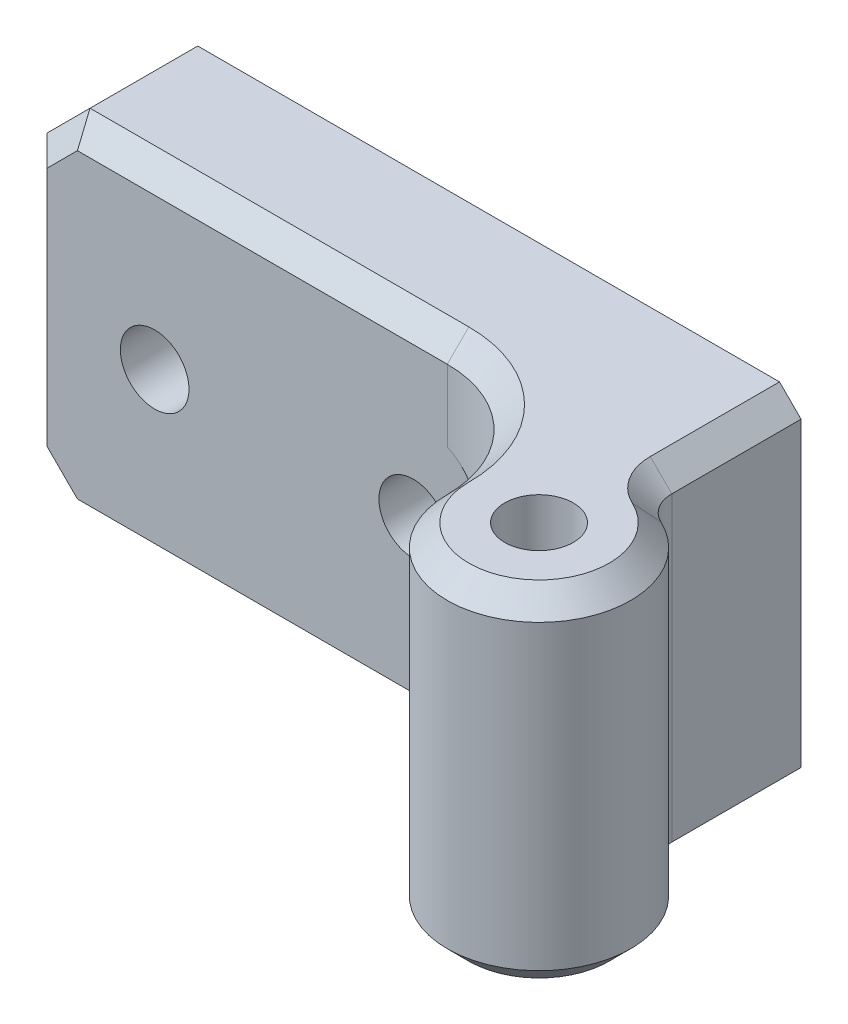
ISO-10303-21;
HEADER;
FILE_DESCRIPTION(('STEP AP214'),'2;1');
FILE_NAME('part.step','',(''),(''),'','','');
FILE_SCHEMA(('AUTOMOTIVE_DESIGN { 1 0 10303 214 1 1 1 1 }'));
ENDSEC;
DATA;
#1=APPLICATION_CONTEXT('core data for automotive mechanical design processes');
#2=APPLICATION_PROTOCOL_DEFINITION('international standard','automotive_design',2000,#1);
#3=PRODUCT_CONTEXT('',#1,'mechanical');
#4=PRODUCT('Part','Part','',(#3));
#5=PRODUCT_RELATED_PRODUCT_CATEGORY('part','',(#4));
#6=PRODUCT_DEFINITION_FORMATION('','',#4);
#7=PRODUCT_DEFINITION_CONTEXT('part definition',#1,'design');
#8=PRODUCT_DEFINITION('design','',#6,#7);
#9=PRODUCT_DEFINITION_SHAPE('','',#8);
#10=(LENGTH_UNIT() NAMED_UNIT(*) SI_UNIT(.MILLI.,.METRE.));
#11=(NAMED_UNIT(*) PLANE_ANGLE_UNIT() SI_UNIT($,.RADIAN.));
#12=(NAMED_UNIT(*) SI_UNIT($,.STERADIAN.) SOLID_ANGLE_UNIT());
#13=UNCERTAINTY_MEASURE_WITH_UNIT(LENGTH_MEASURE(1.E-05),#10,'distance_accuracy_value','');
#14=(GEOMETRIC_REPRESENTATION_CONTEXT(3) GLOBAL_UNCERTAINTY_ASSIGNED_CONTEXT((#13)) GLOBAL_UNIT_ASSIGNED_CONTEXT((#10,
#11,#12)) REPRESENTATION_CONTEXT('',''));
#15=CARTESIAN_POINT('',(0.,0.,0.));
#16=DIRECTION('',(0.,0.,1.));
#17=DIRECTION('',(1.,0.,0.));
#18=AXIS2_PLACEMENT_3D('',#15,#16,#17);
#19=CARTESIAN_POINT('',(-7.01475572015018,730.7032731794,17.8437680924646));
#20=DIRECTION('',(0.,-1.,0.));
#21=DIRECTION('',(1.,0.,0.));
#22=AXIS2_PLACEMENT_3D('',#19,#20,#21);
#23=CYLINDRICAL_SURFACE('',#22,8.31876809246463);
#24=DIRECTION('',(0.,-1.,0.));
#25=VECTOR('',#24,1.);
#26=CARTESIAN_POINT('',(-7.01475572015018,730.7032731794,9.525));
#27=LINE('',#26,#25);
#28=CARTESIAN_POINT('',(-7.01475572015023,709.342729864242,9.525));
#29=VERTEX_POINT('',#28);
#30=CARTESIAN_POINT('',(-7.01475572015024,704.062997102467,9.525));
#31=VERTEX_POINT('',#30);
#32=EDGE_CURVE('E171',#29,#31,#27,.T.);
#33=ORIENTED_EDGE('',*,*,#32,.T.);
#34=CARTESIAN_POINT('',(-7.01475572015028,692.397462626016,9.525));
#35=CARTESIAN_POINT('',(-6.8585295064759,692.464663720382,9.52497377656188));
#36=CARTESIAN_POINT('',(-6.70508771352782,692.538170334425,9.52939946140922));
#37=CARTESIAN_POINT('',(-6.40504056937207,692.696964266671,9.54602231330409));
#38=CARTESIAN_POINT('',(-6.25842888259299,692.782240364319,9.55821211789542));
#39=CARTESIAN_POINT('',(-5.97379153276575,692.963375361611,9.58915008136983));
#40=CARTESIAN_POINT('',(-5.83572321944625,693.05917370387,9.60786193280645));
#41=CARTESIAN_POINT('',(-5.5681022614574,693.260969697122,9.65063339302287));
#42=CARTESIAN_POINT('',(-5.43855152139169,693.366969616309,9.67469419263988));
#43=CARTESIAN_POINT('',(-5.18911936527021,693.587998403627,9.72680222442425));
#44=CARTESIAN_POINT('',(-5.06920504108459,693.702993642958,9.7548348994686));
#45=CARTESIAN_POINT('',(-4.83903065065736,693.941676538618,9.81368467425718));
#46=CARTESIAN_POINT('',(-4.72877392650021,694.065367177574,9.84450273046571));
#47=CARTESIAN_POINT('',(-4.51824865142741,694.320958928606,9.90768248152465));
#48=CARTESIAN_POINT('',(-4.41799705985544,694.452873385828,9.94004666435188));
#49=CARTESIAN_POINT('',(-4.22811737946885,694.724100553597,10.0049786968128));
#50=CARTESIAN_POINT('',(-4.13849004608864,694.863413789213,10.0375465607561));
#51=CARTESIAN_POINT('',(-3.96311783128938,695.160982795241,10.1043269198427));
#52=CARTESIAN_POINT('',(-3.87835534941497,695.319840936982,10.1384429209656));
#53=CARTESIAN_POINT('',(-3.72245447219442,695.644616220251,10.2037550205844));
#54=CARTESIAN_POINT('',(-3.65131102610542,695.810530716859,10.2349521993491));
#55=CARTESIAN_POINT('',(-3.52324371163861,696.148395956546,10.292861727735));
#56=CARTESIAN_POINT('',(-3.46630983961277,696.320342355298,10.319577228123));
#57=CARTESIAN_POINT('',(-3.36718704223734,696.669231093844,10.3671261538804));
#58=CARTESIAN_POINT('',(-3.32499688676546,696.84617301551,10.387960069944));
#59=CARTESIAN_POINT('',(-3.25711624304527,697.197296930048,10.4219462491075));
#60=CARTESIAN_POINT('',(-3.23088898815425,697.371350841382,10.435346883215));
#61=CARTESIAN_POINT('',(-3.19296749988555,697.721446642952,10.4548374082125));
#62=CARTESIAN_POINT('',(-3.18127286856042,697.897488478619,10.4609274992874));
#63=CARTESIAN_POINT('',(-3.17258475369475,698.249971687342,10.4654451552841));
#64=CARTESIAN_POINT('',(-3.17558610152534,698.426412898117,10.4638754141972));
#65=CARTESIAN_POINT('',(-3.19623405680679,698.778194598415,10.4531707804918));
#66=CARTESIAN_POINT('',(-3.21387996196047,698.953535140317,10.4440362506518));
#67=CARTESIAN_POINT('',(-3.26122724520423,699.285223026345,10.4199175273034));
#68=CARTESIAN_POINT('',(-3.28963570089525,699.441802969189,10.4055657798248));
#69=CARTESIAN_POINT('',(-3.35796741384964,699.751887725597,10.371737684766));
#70=CARTESIAN_POINT('',(-3.39789453506229,699.905391488744,10.3522596177487));
#71=CARTESIAN_POINT('',(-3.53442152130737,700.359884684429,10.2873503798431));
#72=CARTESIAN_POINT('',(-3.64779588980144,700.655054953801,10.2354279676237));
#73=CARTESIAN_POINT('',(-3.92499597303092,701.24269614694,10.1185354161637));
#74=CARTESIAN_POINT('',(-4.09166438912317,701.533695186883,10.0529291202356));
#75=CARTESIAN_POINT('',(-4.37426339257399,701.947814941693,9.95455499400188));
#76=CARTESIAN_POINT('',(-4.47400374658584,702.082239611861,9.92173900705312));
#77=CARTESIAN_POINT('',(-4.68399865787901,702.343041744447,9.85743428229677));
#78=CARTESIAN_POINT('',(-4.79425506957798,702.46941778098,9.82594577999683));
#79=CARTESIAN_POINT('',(-5.03479041683673,702.723980224951,9.76302515759287));
#80=CARTESIAN_POINT('',(-5.16597664088253,702.851370898731,9.7318353727175));
#81=CARTESIAN_POINT('',(-5.43940520797831,703.094784602715,9.67433272291206));
#82=CARTESIAN_POINT('',(-5.58164232638203,703.21081294686,9.64801757302676));
#83=CARTESIAN_POINT('',(-5.87591836695125,703.430259022882,9.60197987236416));
#84=CARTESIAN_POINT('',(-6.02792895822961,703.533710895902,9.58223920812016));
#85=CARTESIAN_POINT('',(-6.3408867643811,703.727294038137,9.55085044069935));
#86=CARTESIAN_POINT('',(-6.50182565247476,703.817437441157,9.53919492968428));
#87=CARTESIAN_POINT('',(-6.7236838244021,703.929286108787,9.52989608922528));
#88=CARTESIAN_POINT('',(-6.78133935621798,703.957265544602,9.52807228124201));
#89=CARTESIAN_POINT('',(-6.8974513441391,704.01145689665,9.52562474136075));
#90=CARTESIAN_POINT('',(-6.95590721630708,704.037670026707,9.5250001770441));
#91=CARTESIAN_POINT('',(-7.01475572015025,704.062997102467,9.525));
#92=B_SPLINE_CURVE_WITH_KNOTS('',3,(#34,#35,#36,#37,#38,#39,#40,#41,#42,#43,#44,#45,#46,#47,#48,
#49,#50,#51,#52,#53,#54,#55,#56,#57,#58,#59,#60,#61,#62,#63,#64,#65,#66,#67,#68,#69,#70,#71,#72,
#73,#74,#75,#76,#77,#78,#79,#80,#81,#82,#83,#84,#85,#86,#87,#88,#89,#90,#91),.UNSPECIFIED.,.F.,
.F.,(4,2,2,2,2,2,2,2,2,2,2,2,2,2,2,2,2,2,2,2,2,2,2,2,2,2,2,2,4),(0.,0.509907809169994,
1.01933280816261,1.52596603634282,2.03271216951694,2.53764691502082,3.04275571224508,
3.54870665595174,4.05469355358308,4.60381710864594,5.15273662005111,5.70126859091361,
6.24975478481087,6.7785990222245,7.30742877795505,7.83607255571554,8.36469098319881,
8.8434890348074,9.32244788688929,10.2797675903837,11.3004531769402,11.8117477239014,
12.3231326006101,12.8789241369897,13.4344544865808,13.9884413739765,14.5419200106331,
14.7342246253894,14.9263957094022),.UNSPECIFIED.);
#93=CARTESIAN_POINT('',(-7.01475572015027,692.397462626016,9.525));
#94=VERTEX_POINT('',#93);
#95=EDGE_CURVE('E161',#94,#31,#92,.T.);
#96=ORIENTED_EDGE('',*,*,#95,.F.);
#97=CARTESIAN_POINT('',(-7.01475572015028,687.117729864242,9.525));
#98=VERTEX_POINT('',#97);
#99=EDGE_CURVE('E169',#94,#98,#27,.T.);
#100=ORIENTED_EDGE('',*,*,#99,.T.);
#101=CARTESIAN_POINT('',(-7.01475572015028,687.117729864242,17.8437680924646));
#102=DIRECTION('',(0.,1.,0.));
#103=DIRECTION('',(-1.,0.,0.));
#104=AXIS2_PLACEMENT_3D('',#101,#102,#103);
#105=CIRCLE('',#104,8.31876809246463);
#106=CARTESIAN_POINT('',(1.30401237231436,687.117729864242,17.8437680924646));
#107=VERTEX_POINT('',#106);
#108=EDGE_CURVE('E256',#98,#107,#105,.F.);
#109=ORIENTED_EDGE('',*,*,#108,.T.);
#110=DIRECTION('',(0.,-1.,0.));
#111=VECTOR('',#110,1.);
#112=CARTESIAN_POINT('',(1.30401237231446,730.7032731794,17.8437680924646));
#113=LINE('',#112,#111);
#114=CARTESIAN_POINT('',(1.30401237231441,709.342729864242,17.8437680924646));
#115=VERTEX_POINT('',#114);
#116=EDGE_CURVE('E178',#115,#107,#113,.T.);
#117=ORIENTED_EDGE('',*,*,#116,.F.);
#118=CARTESIAN_POINT('',(-7.01475572015023,709.342729864242,17.8437680924646));
#119=DIRECTION('',(0.,-1.,0.));
#120=DIRECTION('',(1.,0.,0.));
#121=AXIS2_PLACEMENT_3D('',#118,#119,#120);
#122=CIRCLE('',#121,8.31876809246463);
#123=EDGE_CURVE('E254',#115,#29,#122,.F.);
#124=ORIENTED_EDGE('',*,*,#123,.T.);
#125=EDGE_LOOP('',(#33,#96,#100,#109,#117,#124));
#126=FACE_BOUND('',#125,.T.);
#127=ADVANCED_FACE('F37',(#126),#23,.F.);
#128=CARTESIAN_POINT('',(-38.100000000032,710.930229864242,9.525));
#129=DIRECTION('',(0.,-1.,0.));
#130=DIRECTION('',(0.,0.,-1.));
#131=AXIS2_PLACEMENT_3D('',#128,#129,#130);
#132=PLANE('',#131);
#133=CARTESIAN_POINT('',(11.9503001493874,710.930229864242,9.525));
#134=DIRECTION('',(0.,-1.,0.));
#135=DIRECTION('',(0.,0.,-1.));
#136=AXIS2_PLACEMENT_3D('',#133,#134,#135);
#137=CIRCLE('',#136,4.01280014941934);
#138=CARTESIAN_POINT('',(10.2509532079631,710.930229864242,13.1602145757647));
#139=VERTEX_POINT('',#138);
#140=CARTESIAN_POINT('',(7.93749999996805,710.930229864242,9.525));
#141=VERTEX_POINT('',#140);
#142=EDGE_CURVE('E242',#139,#141,#137,.T.);
#143=ORIENTED_EDGE('',*,*,#142,.T.);
#144=DIRECTION('',(0.,0.,-1.));
#145=VECTOR('',#144,1.);
#146=CARTESIAN_POINT('',(7.93749999996798,710.930229864242,9.525));
#147=LINE('',#146,#145);
#148=CARTESIAN_POINT('',(7.93749999996798,710.930229864242,0.));
#149=VERTEX_POINT('',#148);
#150=EDGE_CURVE('E244',#141,#149,#147,.T.);
#151=ORIENTED_EDGE('',*,*,#150,.T.);
#152=DIRECTION('',(-1.,0.,0.));
#153=VECTOR('',#152,1.);
#154=CARTESIAN_POINT('',(-38.100000000032,710.930229864242,0.));
#155=LINE('',#154,#153);
#156=CARTESIAN_POINT('',(-34.925000000032,710.930229864242,0.));
#157=VERTEX_POINT('',#156);
#158=EDGE_CURVE('E194',#149,#157,#155,.T.);
#159=ORIENTED_EDGE('',*,*,#158,.T.);
#160=DIRECTION('',(0.,0.,1.));
#161=VECTOR('',#160,1.);
#162=CARTESIAN_POINT('',(-34.925000000032,710.930229864242,9.525));
#163=LINE('',#162,#161);
#164=CARTESIAN_POINT('',(-34.925000000032,710.930229864242,7.93750000000007));
#165=VERTEX_POINT('',#164);
#166=EDGE_CURVE('E214',#157,#165,#163,.T.);
#167=ORIENTED_EDGE('',*,*,#166,.T.);
#168=DIRECTION('',(1.,0.,0.));
#169=VECTOR('',#168,1.);
#170=CARTESIAN_POINT('',(-7.01475572015022,710.930229864242,7.93750000000001));
#171=LINE('',#170,#169);
#172=CARTESIAN_POINT('',(-7.01475572015023,710.930229864242,7.93750000000001));
#173=VERTEX_POINT('',#172);
#174=EDGE_CURVE('E236',#165,#173,#171,.T.);
#175=ORIENTED_EDGE('',*,*,#174,.T.);
#176=CARTESIAN_POINT('',(-7.01475572015022,710.930229864242,17.8437680924646));
#177=DIRECTION('',(0.,-1.,0.));
#178=DIRECTION('',(0.,0.,-1.));
#179=AXIS2_PLACEMENT_3D('',#176,#177,#178);
#180=CIRCLE('',#179,9.90626809246465);
#181=CARTESIAN_POINT('',(2.89151237231442,710.930229864242,17.8437680924646));
#182=VERTEX_POINT('',#181);
#183=EDGE_CURVE('E238',#173,#182,#180,.T.);
#184=ORIENTED_EDGE('',*,*,#183,.T.);
#185=CARTESIAN_POINT('',(8.06154122753639,710.930229864242,17.8437680924646));
#186=DIRECTION('',(0.,-1.,0.));
#187=DIRECTION('',(0.,0.,-1.));
#188=AXIS2_PLACEMENT_3D('',#185,#186,#187);
#189=CIRCLE('',#188,5.17002885522202);
#190=EDGE_CURVE('E240',#182,#139,#189,.F.);
#191=ORIENTED_EDGE('',*,*,#190,.T.);
#192=EDGE_LOOP('',(#143,#151,#159,#167,#175,#184,#191));
#193=FACE_BOUND('',#192,.T.);
#194=CARTESIAN_POINT('',(8.06154122753638,710.930229864242,17.8437680924646));
#195=DIRECTION('',(0.,1.,0.));
#196=DIRECTION('',(0.,0.,1.));
#197=AXIS2_PLACEMENT_3D('',#194,#195,#196);
#198=CIRCLE('',#197,2.5273);
#199=CARTESIAN_POINT('',(8.06154122753638,710.930229864242,20.3710680924646));
#200=VERTEX_POINT('',#199);
#201=EDGE_CURVE('E305',#200,#200,#198,.T.);
#202=ORIENTED_EDGE('',*,*,#201,.F.);
#203=EDGE_LOOP('',(#202));
#204=FACE_BOUND('',#203,.T.);
#205=ADVANCED_FACE('F352',(#193,#204),#132,.F.);
#206=CARTESIAN_POINT('',(0.,0.,9.525));
#207=DIRECTION('',(0.,0.,1.));
#208=DIRECTION('',(1.,0.,0.));
#209=AXIS2_PLACEMENT_3D('',#206,#207,#208);
#210=PLANE('',#209);
#211=CARTESIAN_POINT('',(-9.52500000003202,698.230229864242,9.525));
#212=DIRECTION('',(0.,0.,1.));
#213=DIRECTION('',(1.,0.,0.));
#214=AXIS2_PLACEMENT_3D('',#211,#212,#213);
#215=CIRCLE('',#214,6.35);
#216=EDGE_CURVE('E158',#94,#31,#215,.T.);
#217=ORIENTED_EDGE('',*,*,#216,.T.);
#218=ORIENTED_EDGE('',*,*,#32,.F.);
#219=DIRECTION('',(-1.,0.,0.));
#220=VECTOR('',#219,1.);
#221=CARTESIAN_POINT('',(-34.925000000032,709.342729864242,9.525));
#222=LINE('',#221,#220);
#223=CARTESIAN_POINT('',(-34.267435969765,709.342729864242,9.525));
#224=VERTEX_POINT('',#223);
#225=EDGE_CURVE('E260',#29,#224,#222,.T.);
#226=ORIENTED_EDGE('',*,*,#225,.T.);
#227=DIRECTION('',(-0.707106781186544,-0.707106781186551,0.));
#228=VECTOR('',#227,1.);
#229=CARTESIAN_POINT('',(-371.805082917003,371.805082917,9.525));
#230=LINE('',#229,#228);
#231=CARTESIAN_POINT('',(-36.5125000000321,707.097665833974,9.525));
#232=VERTEX_POINT('',#231);
#233=EDGE_CURVE('E258',#224,#232,#230,.T.);
#234=ORIENTED_EDGE('',*,*,#233,.T.);
#235=DIRECTION('',(0.,-1.,0.));
#236=VECTOR('',#235,1.);
#237=CARTESIAN_POINT('',(-36.5125000000321,688.705229864242,9.525));
#238=LINE('',#237,#236);
#239=CARTESIAN_POINT('',(-36.5125000000321,689.362793894509,9.525));
#240=VERTEX_POINT('',#239);
#241=EDGE_CURVE('E262',#232,#240,#238,.T.);
#242=ORIENTED_EDGE('',*,*,#241,.T.);
#243=DIRECTION('',(0.707106781186541,-0.707106781186554,0.));
#244=VECTOR('',#243,1.);
#245=CARTESIAN_POINT('',(326.425146947238,326.425146947232,9.525));
#246=LINE('',#245,#244);
#247=CARTESIAN_POINT('',(-34.2674359697646,687.117729864242,9.525));
#248=VERTEX_POINT('',#247);
#249=EDGE_CURVE('E264',#240,#248,#246,.T.);
#250=ORIENTED_EDGE('',*,*,#249,.T.);
#251=DIRECTION('',(1.,0.,0.));
#252=VECTOR('',#251,1.);
#253=CARTESIAN_POINT('',(-7.01475572015028,687.117729864242,9.525));
#254=LINE('',#253,#252);
#255=EDGE_CURVE('E176',#248,#98,#254,.T.);
#256=ORIENTED_EDGE('',*,*,#255,.T.);
#257=ORIENTED_EDGE('',*,*,#99,.F.);
#258=EDGE_LOOP('',(#217,#218,#226,#234,#242,#250,#256,#257));
#259=FACE_BOUND('',#258,.T.);
#260=CARTESIAN_POINT('',(-28.575000000032,698.230229864242,9.525));
#261=DIRECTION('',(0.,0.,1.));
#262=DIRECTION('',(1.,0.,0.));
#263=AXIS2_PLACEMENT_3D('',#260,#261,#262);
#264=CIRCLE('',#263,2.52729999999999);
#265=CARTESIAN_POINT('',(-26.047700000032,698.230229864242,9.525));
#266=VERTEX_POINT('',#265);
#267=EDGE_CURVE('E317',#266,#266,#264,.T.);
#268=ORIENTED_EDGE('',*,*,#267,.F.);
#269=EDGE_LOOP('',(#268));
#270=FACE_BOUND('',#269,.T.);
#271=CARTESIAN_POINT('',(-9.52500000003202,698.230229864242,9.525));
#272=DIRECTION('',(0.,0.,-1.));
#273=DIRECTION('',(-1.,0.,0.));
#274=AXIS2_PLACEMENT_3D('',#271,#272,#273);
#275=CIRCLE('',#274,2.5273);
#276=CARTESIAN_POINT('',(-12.052300000032,698.230229864242,9.525));
#277=VERTEX_POINT('',#276);
#278=EDGE_CURVE('E11',#277,#277,#275,.F.);
#279=ORIENTED_EDGE('',*,*,#278,.F.);
#280=EDGE_LOOP('',(#279));
#281=FACE_BOUND('',#280,.T.);
#282=ADVANCED_FACE('F173',(#259,#270,#281),#210,.T.);
#283=CARTESIAN_POINT('',(-38.100000000032,710.930229864242,9.525));
#284=DIRECTION('',(1.,0.,0.));
#285=DIRECTION('',(0.,0.,-1.));
#286=AXIS2_PLACEMENT_3D('',#283,#284,#285);
#287=PLANE('',#286);
#288=DIRECTION('',(0.,0.,1.));
#289=VECTOR('',#288,1.);
#290=CARTESIAN_POINT('',(-38.100000000032,688.705229864242,9.525));
#291=LINE('',#290,#289);
#292=CARTESIAN_POINT('',(-38.100000000032,688.705229864242,0.));
#293=VERTEX_POINT('',#292);
#294=CARTESIAN_POINT('',(-38.100000000032,688.705229864242,7.93750000000001));
#295=VERTEX_POINT('',#294);
#296=EDGE_CURVE('E212',#293,#295,#291,.T.);
#297=ORIENTED_EDGE('',*,*,#296,.T.);
#298=DIRECTION('',(0.,1.,0.));
#299=VECTOR('',#298,1.);
#300=CARTESIAN_POINT('',(-38.100000000032,707.755229864242,7.93750000000001));
#301=LINE('',#300,#299);
#302=CARTESIAN_POINT('',(-38.100000000032,707.755229864242,7.93750000000007));
#303=VERTEX_POINT('',#302);
#304=EDGE_CURVE('E53',#295,#303,#301,.T.);
#305=ORIENTED_EDGE('',*,*,#304,.T.);
#306=DIRECTION('',(0.,0.,-1.));
#307=VECTOR('',#306,1.);
#308=CARTESIAN_POINT('',(-38.100000000032,707.755229864242,9.525));
#309=LINE('',#308,#307);
#310=CARTESIAN_POINT('',(-38.100000000032,707.755229864242,0.));
#311=VERTEX_POINT('',#310);
#312=EDGE_CURVE('E210',#303,#311,#309,.T.);
#313=ORIENTED_EDGE('',*,*,#312,.T.);
#314=DIRECTION('',(0.,-1.,0.));
#315=VECTOR('',#314,1.);
#316=CARTESIAN_POINT('',(-38.100000000032,710.930229864242,0.));
#317=LINE('',#316,#315);
#318=EDGE_CURVE('E180',#311,#293,#317,.T.);
#319=ORIENTED_EDGE('',*,*,#318,.T.);
#320=EDGE_LOOP('',(#297,#305,#313,#319));
#321=FACE_BOUND('',#320,.T.);
#322=ADVANCED_FACE('F359',(#321),#287,.F.);
#323=CARTESIAN_POINT('',(-38.100000000032,685.530229864242,9.525));
#324=DIRECTION('',(0.,1.,0.));
#325=DIRECTION('',(0.,0.,1.));
#326=AXIS2_PLACEMENT_3D('',#323,#324,#325);
#327=PLANE('',#326);
#328=CARTESIAN_POINT('',(8.06154122753638,685.530229864242,17.8437680924646));
#329=DIRECTION('',(0.,1.,0.));
#330=DIRECTION('',(0.,0.,1.));
#331=AXIS2_PLACEMENT_3D('',#328,#329,#330);
#332=CIRCLE('',#331,2.5273);
#333=CARTESIAN_POINT('',(8.06154122753638,685.530229864242,20.3710680924646));
#334=VERTEX_POINT('',#333);
#335=EDGE_CURVE('E185',#334,#334,#332,.T.);
#336=ORIENTED_EDGE('',*,*,#335,.T.);
#337=EDGE_LOOP('',(#336));
#338=FACE_BOUND('',#337,.T.);
#339=DIRECTION('',(1.,0.,0.));
#340=VECTOR('',#339,1.);
#341=CARTESIAN_POINT('',(-38.100000000032,685.530229864242,0.));
#342=LINE('',#341,#340);
#343=CARTESIAN_POINT('',(-34.9250000000319,685.530229864242,0.));
#344=VERTEX_POINT('',#343);
#345=CARTESIAN_POINT('',(7.93749999996798,685.530229864242,0.));
#346=VERTEX_POINT('',#345);
#347=EDGE_CURVE('E197',#344,#346,#342,.T.);
#348=ORIENTED_EDGE('',*,*,#347,.T.);
#349=DIRECTION('',(0.,0.,1.));
#350=VECTOR('',#349,1.);
#351=CARTESIAN_POINT('',(7.93749999996798,685.530229864242,9.525));
#352=LINE('',#351,#350);
#353=CARTESIAN_POINT('',(7.93749999996798,685.530229864242,9.525));
#354=VERTEX_POINT('',#353);
#355=EDGE_CURVE('E234',#346,#354,#352,.T.);
#356=ORIENTED_EDGE('',*,*,#355,.T.);
#357=CARTESIAN_POINT('',(11.9503001493873,685.530229864242,9.525));
#358=DIRECTION('',(0.,1.,0.));
#359=DIRECTION('',(0.,0.,1.));
#360=AXIS2_PLACEMENT_3D('',#357,#358,#359);
#361=CIRCLE('',#360,4.01280014941935);
#362=CARTESIAN_POINT('',(10.2509532079631,685.530229864242,13.1602145757647));
#363=VERTEX_POINT('',#362);
#364=EDGE_CURVE('E232',#354,#363,#361,.T.);
#365=ORIENTED_EDGE('',*,*,#364,.T.);
#366=CARTESIAN_POINT('',(8.06154122753638,685.530229864242,17.8437680924646));
#367=DIRECTION('',(0.,1.,0.));
#368=DIRECTION('',(0.,0.,1.));
#369=AXIS2_PLACEMENT_3D('',#366,#367,#368);
#370=CIRCLE('',#369,5.17002885522203);
#371=CARTESIAN_POINT('',(2.89151237231434,685.530229864242,17.8437680924646));
#372=VERTEX_POINT('',#371);
#373=EDGE_CURVE('E230',#363,#372,#370,.F.);
#374=ORIENTED_EDGE('',*,*,#373,.T.);
#375=CARTESIAN_POINT('',(-7.01475572015028,685.530229864242,17.8437680924646));
#376=DIRECTION('',(0.,1.,0.));
#377=DIRECTION('',(0.,0.,1.));
#378=AXIS2_PLACEMENT_3D('',#375,#376,#377);
#379=CIRCLE('',#378,9.90626809246463);
#380=CARTESIAN_POINT('',(-7.01475572015028,685.530229864242,7.93750000000001));
#381=VERTEX_POINT('',#380);
#382=EDGE_CURVE('E228',#372,#381,#379,.T.);
#383=ORIENTED_EDGE('',*,*,#382,.T.);
#384=DIRECTION('',(-1.,0.,0.));
#385=VECTOR('',#384,1.);
#386=CARTESIAN_POINT('',(-34.9250000000319,685.530229864242,7.93750000000001));
#387=LINE('',#386,#385);
#388=CARTESIAN_POINT('',(-34.9250000000319,685.530229864242,7.93750000000001));
#389=VERTEX_POINT('',#388);
#390=EDGE_CURVE('E226',#381,#389,#387,.T.);
#391=ORIENTED_EDGE('',*,*,#390,.T.);
#392=DIRECTION('',(0.,0.,-1.));
#393=VECTOR('',#392,1.);
#394=CARTESIAN_POINT('',(-34.9250000000319,685.530229864242,9.525));
#395=LINE('',#394,#393);
#396=EDGE_CURVE('E193',#389,#344,#395,.T.);
#397=ORIENTED_EDGE('',*,*,#396,.T.);
#398=EDGE_LOOP('',(#348,#356,#365,#374,#383,#391,#397));
#399=FACE_BOUND('',#398,.T.);
#400=ADVANCED_FACE('F369',(#338,#399),#327,.F.);
#401=CARTESIAN_POINT('',(9.52499999996798,710.930229864242,9.525));
#402=DIRECTION('',(-1.,0.,0.));
#403=DIRECTION('',(0.,0.,1.));
#404=AXIS2_PLACEMENT_3D('',#401,#402,#403);
#405=PLANE('',#404);
#406=DIRECTION('',(0.,1.,0.));
#407=VECTOR('',#406,1.);
#408=CARTESIAN_POINT('',(9.52499999996798,710.930229864242,9.525));
#409=LINE('',#408,#407);
#410=CARTESIAN_POINT('',(9.52499999996798,687.117729864242,9.525));
#411=VERTEX_POINT('',#410);
#412=CARTESIAN_POINT('',(9.52499999996798,709.342729864242,9.525));
#413=VERTEX_POINT('',#412);
#414=EDGE_CURVE('E190',#411,#413,#409,.T.);
#415=ORIENTED_EDGE('',*,*,#414,.F.);
#416=DIRECTION('',(0.,0.,-1.));
#417=VECTOR('',#416,1.);
#418=CARTESIAN_POINT('',(9.52499999996798,687.117729864242,9.525));
#419=LINE('',#418,#417);
#420=CARTESIAN_POINT('',(9.52499999996798,687.117729864242,0.));
#421=VERTEX_POINT('',#420);
#422=EDGE_CURVE('E219',#411,#421,#419,.T.);
#423=ORIENTED_EDGE('',*,*,#422,.T.);
#424=DIRECTION('',(0.,1.,0.));
#425=VECTOR('',#424,1.);
#426=CARTESIAN_POINT('',(9.52499999996798,710.930229864242,0.));
#427=LINE('',#426,#425);
#428=CARTESIAN_POINT('',(9.52499999996798,709.342729864242,0.));
#429=VERTEX_POINT('',#428);
#430=EDGE_CURVE('E200',#421,#429,#427,.T.);
#431=ORIENTED_EDGE('',*,*,#430,.T.);
#432=DIRECTION('',(0.,0.,1.));
#433=VECTOR('',#432,1.);
#434=CARTESIAN_POINT('',(9.52499999996798,709.342729864242,9.525));
#435=LINE('',#434,#433);
#436=EDGE_CURVE('E217',#429,#413,#435,.T.);
#437=ORIENTED_EDGE('',*,*,#436,.T.);
#438=EDGE_LOOP('',(#415,#423,#431,#437));
#439=FACE_BOUND('',#438,.T.);
#440=ADVANCED_FACE('F362',(#439),#405,.F.);
#441=CARTESIAN_POINT('',(0.,0.,0.));
#442=DIRECTION('',(0.,0.,1.));
#443=DIRECTION('',(1.,0.,0.));
#444=AXIS2_PLACEMENT_3D('',#441,#442,#443);
#445=PLANE('',#444);
#446=CARTESIAN_POINT('',(-28.575000000032,698.230229864242,0.));
#447=DIRECTION('',(0.,0.,-1.));
#448=DIRECTION('',(-1.,0.,0.));
#449=AXIS2_PLACEMENT_3D('',#446,#447,#448);
#450=CIRCLE('',#449,2.5273);
#451=CARTESIAN_POINT('',(-31.102300000032,698.230229864242,0.));
#452=VERTEX_POINT('',#451);
#453=EDGE_CURVE('E166',#452,#452,#450,.T.);
#454=ORIENTED_EDGE('',*,*,#453,.F.);
#455=EDGE_LOOP('',(#454));
#456=FACE_BOUND('',#455,.T.);
#457=CARTESIAN_POINT('',(-9.52500000003202,698.230229864242,0.));
#458=DIRECTION('',(0.,0.,-1.));
#459=DIRECTION('',(-1.,0.,0.));
#460=AXIS2_PLACEMENT_3D('',#457,#458,#459);
#461=CIRCLE('',#460,2.5273);
#462=CARTESIAN_POINT('',(-12.052300000032,698.230229864242,0.));
#463=VERTEX_POINT('',#462);
#464=EDGE_CURVE('E274',#463,#463,#461,.T.);
#465=ORIENTED_EDGE('',*,*,#464,.F.);
#466=EDGE_LOOP('',(#465));
#467=FACE_BOUND('',#466,.T.);
#468=ORIENTED_EDGE('',*,*,#430,.F.);
#469=DIRECTION('',(0.707106781186555,0.70710678118654,0.));
#470=VECTOR('',#469,1.);
#471=CARTESIAN_POINT('',(9.52499999996798,687.117729864242,0.));
#472=LINE('',#471,#470);
#473=EDGE_CURVE('E224',#421,#346,#472,.F.);
#474=ORIENTED_EDGE('',*,*,#473,.T.);
#475=ORIENTED_EDGE('',*,*,#347,.F.);
#476=DIRECTION('',(0.707106781186541,-0.707106781186554,0.));
#477=VECTOR('',#476,1.);
#478=CARTESIAN_POINT('',(-34.9250000000319,685.530229864242,0.));
#479=LINE('',#478,#477);
#480=EDGE_CURVE('E208',#344,#293,#479,.F.);
#481=ORIENTED_EDGE('',*,*,#480,.T.);
#482=ORIENTED_EDGE('',*,*,#318,.F.);
#483=DIRECTION('',(-0.707106781186544,-0.707106781186551,0.));
#484=VECTOR('',#483,1.);
#485=CARTESIAN_POINT('',(-38.100000000032,707.755229864242,0.));
#486=LINE('',#485,#484);
#487=EDGE_CURVE('E205',#311,#157,#486,.F.);
#488=ORIENTED_EDGE('',*,*,#487,.T.);
#489=ORIENTED_EDGE('',*,*,#158,.F.);
#490=DIRECTION('',(-0.707106781186555,0.70710678118654,0.));
#491=VECTOR('',#490,1.);
#492=CARTESIAN_POINT('',(7.93749999996798,710.930229864242,0.));
#493=LINE('',#492,#491);
#494=EDGE_CURVE('E222',#149,#429,#493,.F.);
#495=ORIENTED_EDGE('',*,*,#494,.T.);
#496=EDGE_LOOP('',(#468,#474,#475,#481,#482,#488,#489,#495));
#497=FACE_BOUND('',#496,.T.);
#498=ADVANCED_FACE('F355',(#456,#467,#497),#445,.F.);
#499=CARTESIAN_POINT('',(11.9503001493874,730.7032731794,9.525));
#500=DIRECTION('',(0.,-1.,0.));
#501=DIRECTION('',(1.,0.,0.));
#502=AXIS2_PLACEMENT_3D('',#499,#500,#501);
#503=CYLINDRICAL_SURFACE('',#502,2.42530014941935);
#504=DIRECTION('',(0.,-1.,0.));
#505=VECTOR('',#504,1.);
#506=CARTESIAN_POINT('',(10.9232302138094,730.7032731794,11.7220908406812));
#507=LINE('',#506,#505);
#508=CARTESIAN_POINT('',(10.9232302138094,709.342729864242,11.7220908406812));
#509=VERTEX_POINT('',#508);
#510=CARTESIAN_POINT('',(10.9232302138093,687.117729864242,11.7220908406812));
#511=VERTEX_POINT('',#510);
#512=EDGE_CURVE('E182',#509,#511,#507,.T.);
#513=ORIENTED_EDGE('',*,*,#512,.T.);
#514=CARTESIAN_POINT('',(11.9503001493873,687.117729864242,9.525));
#515=DIRECTION('',(0.,1.,0.));
#516=DIRECTION('',(-1.,0.,0.));
#517=AXIS2_PLACEMENT_3D('',#514,#515,#516);
#518=CIRCLE('',#517,2.42530014941935);
#519=EDGE_CURVE('E248',#511,#411,#518,.F.);
#520=ORIENTED_EDGE('',*,*,#519,.T.);
#521=ORIENTED_EDGE('',*,*,#414,.T.);
#522=CARTESIAN_POINT('',(11.9503001493874,709.342729864242,9.525));
#523=DIRECTION('',(0.,-1.,0.));
#524=DIRECTION('',(1.,0.,0.));
#525=AXIS2_PLACEMENT_3D('',#522,#523,#524);
#526=CIRCLE('',#525,2.42530014941935);
#527=EDGE_CURVE('E246',#413,#509,#526,.F.);
#528=ORIENTED_EDGE('',*,*,#527,.T.);
#529=EDGE_LOOP('',(#513,#520,#521,#528));
#530=FACE_BOUND('',#529,.T.);
#531=ADVANCED_FACE('F348',(#530),#503,.F.);
#532=CARTESIAN_POINT('',(8.06154122753637,666.417051953877,17.8437680924647));
#533=DIRECTION('',(0.,1.,0.));
#534=DIRECTION('',(0.,0.,1.));
#535=AXIS2_PLACEMENT_3D('',#532,#533,#534);
#536=CYLINDRICAL_SURFACE('',#535,6.75752885522203);
#537=ORIENTED_EDGE('',*,*,#116,.T.);
#538=CARTESIAN_POINT('',(8.06154122753638,687.117729864242,17.8437680924646));
#539=DIRECTION('',(0.,1.,0.));
#540=DIRECTION('',(0.,0.,1.));
#541=AXIS2_PLACEMENT_3D('',#538,#539,#540);
#542=CIRCLE('',#541,6.75752885522203);
#543=EDGE_CURVE('E252',#107,#511,#542,.T.);
#544=ORIENTED_EDGE('',*,*,#543,.T.);
#545=ORIENTED_EDGE('',*,*,#512,.F.);
#546=CARTESIAN_POINT('',(8.06154122753639,709.342729864242,17.8437680924646));
#547=DIRECTION('',(0.,-1.,0.));
#548=DIRECTION('',(0.,0.,-1.));
#549=AXIS2_PLACEMENT_3D('',#546,#547,#548);
#550=CIRCLE('',#549,6.75752885522203);
#551=EDGE_CURVE('E250',#509,#115,#550,.T.);
#552=ORIENTED_EDGE('',*,*,#551,.T.);
#553=EDGE_LOOP('',(#537,#544,#545,#552));
#554=FACE_BOUND('',#553,.T.);
#555=ADVANCED_FACE('F344',(#554),#536,.T.);
#556=CARTESIAN_POINT('',(8.06154122753638,710.930229864242,17.8437680924646));
#557=DIRECTION('',(0.,1.,0.));
#558=DIRECTION('',(0.,0.,1.));
#559=AXIS2_PLACEMENT_3D('',#556,#557,#558);
#560=CYLINDRICAL_SURFACE('',#559,2.5273);
#561=ORIENTED_EDGE('',*,*,#335,.F.);
#562=EDGE_LOOP('',(#561));
#563=FACE_BOUND('',#562,.T.);
#564=ORIENTED_EDGE('',*,*,#201,.T.);
#565=EDGE_LOOP('',(#564));
#566=FACE_BOUND('',#565,.T.);
#567=ADVANCED_FACE('F340',(#563,#566),#560,.F.);
#568=CARTESIAN_POINT('',(-34.9250000000319,685.530229864242,9.525));
#569=DIRECTION('',(0.707106781186555,0.707106781186541,0.));
#570=DIRECTION('',(0.,0.,-1.));
#571=AXIS2_PLACEMENT_3D('',#568,#569,#570);
#572=PLANE('',#571);
#573=ORIENTED_EDGE('',*,*,#396,.F.);
#574=DIRECTION('',(0.707106781186541,-0.707106781186554,0.));
#575=VECTOR('',#574,1.);
#576=CARTESIAN_POINT('',(-34.9250000000319,685.530229864242,7.93750000000001));
#577=LINE('',#576,#575);
#578=EDGE_CURVE('E61',#389,#295,#577,.F.);
#579=ORIENTED_EDGE('',*,*,#578,.T.);
#580=ORIENTED_EDGE('',*,*,#296,.F.);
#581=ORIENTED_EDGE('',*,*,#480,.F.);
#582=EDGE_LOOP('',(#573,#579,#580,#581));
#583=FACE_BOUND('',#582,.T.);
#584=ADVANCED_FACE('F343',(#583),#572,.F.);
#585=CARTESIAN_POINT('',(-38.100000000032,707.755229864242,9.525));
#586=DIRECTION('',(0.707106781186551,-0.707106781186544,0.));
#587=DIRECTION('',(0.,0.,-1.));
#588=AXIS2_PLACEMENT_3D('',#585,#586,#587);
#589=PLANE('',#588);
#590=ORIENTED_EDGE('',*,*,#312,.F.);
#591=DIRECTION('',(-0.707106781186544,-0.707106781186551,0.));
#592=VECTOR('',#591,1.);
#593=CARTESIAN_POINT('',(-38.100000000032,707.755229864242,7.93750000000007));
#594=LINE('',#593,#592);
#595=EDGE_CURVE('E46',#303,#165,#594,.F.);
#596=ORIENTED_EDGE('',*,*,#595,.T.);
#597=ORIENTED_EDGE('',*,*,#166,.F.);
#598=ORIENTED_EDGE('',*,*,#487,.F.);
#599=EDGE_LOOP('',(#590,#596,#597,#598));
#600=FACE_BOUND('',#599,.T.);
#601=ADVANCED_FACE('F382',(#600),#589,.F.);
#602=CARTESIAN_POINT('',(7.93749999996798,710.930229864242,9.525));
#603=DIRECTION('',(-0.70710678118654,-0.707106781186555,0.));
#604=DIRECTION('',(0.,0.,-1.));
#605=AXIS2_PLACEMENT_3D('',#602,#603,#604);
#606=PLANE('',#605);
#607=ORIENTED_EDGE('',*,*,#494,.F.);
#608=ORIENTED_EDGE('',*,*,#150,.F.);
#609=DIRECTION('',(-0.707106781186555,0.70710678118654,0.));
#610=VECTOR('',#609,1.);
#611=CARTESIAN_POINT('',(9.52499999996798,709.342729864242,9.525));
#612=LINE('',#611,#610);
#613=EDGE_CURVE('E303',#413,#141,#612,.T.);
#614=ORIENTED_EDGE('',*,*,#613,.F.);
#615=ORIENTED_EDGE('',*,*,#436,.F.);
#616=EDGE_LOOP('',(#607,#608,#614,#615));
#617=FACE_BOUND('',#616,.T.);
#618=ADVANCED_FACE('F40',(#617),#606,.F.);
#619=CARTESIAN_POINT('',(11.9503001493874,710.930229864242,9.525));
#620=DIRECTION('',(0.,1.,0.));
#621=DIRECTION('',(-1.,0.,0.));
#622=AXIS2_PLACEMENT_3D('',#619,#620,#621);
#623=CONICAL_SURFACE('',#622,4.01280014941935,0.785398163397458);
#624=ORIENTED_EDGE('',*,*,#613,.T.);
#625=ORIENTED_EDGE('',*,*,#142,.F.);
#626=DIRECTION('',(-0.299446695854913,0.707106781186543,0.640571367094707));
#627=VECTOR('',#626,1.);
#628=CARTESIAN_POINT('',(10.9232302138094,709.342729864242,11.7220908406812));
#629=LINE('',#628,#627);
#630=EDGE_CURVE('E301',#509,#139,#629,.T.);
#631=ORIENTED_EDGE('',*,*,#630,.F.);
#632=ORIENTED_EDGE('',*,*,#527,.F.);
#633=EDGE_LOOP('',(#624,#625,#631,#632));
#634=FACE_BOUND('',#633,.T.);
#635=ADVANCED_FACE('F463',(#634),#623,.F.);
#636=CARTESIAN_POINT('',(8.06154122753639,709.342729864242,17.8437680924646));
#637=DIRECTION('',(0.,-1.,0.));
#638=DIRECTION('',(0.,0.,-1.));
#639=AXIS2_PLACEMENT_3D('',#636,#637,#638);
#640=CONICAL_SURFACE('',#639,6.75752885522203,0.785398163397458);
#641=ORIENTED_EDGE('',*,*,#630,.T.);
#642=ORIENTED_EDGE('',*,*,#190,.F.);
#643=DIRECTION('',(0.707106781186557,0.707106781186538,0.));
#644=VECTOR('',#643,1.);
#645=CARTESIAN_POINT('',(1.30401237231436,709.342729864242,17.8437680924646));
#646=LINE('',#645,#644);
#647=EDGE_CURVE('E298',#115,#182,#646,.T.);
#648=ORIENTED_EDGE('',*,*,#647,.F.);
#649=ORIENTED_EDGE('',*,*,#551,.F.);
#650=EDGE_LOOP('',(#641,#642,#648,#649));
#651=FACE_BOUND('',#650,.T.);
#652=ADVANCED_FACE('F457',(#651),#640,.T.);
#653=CARTESIAN_POINT('',(-7.01475572015022,710.930229864242,17.8437680924646));
#654=DIRECTION('',(0.,1.,0.));
#655=DIRECTION('',(-1.,0.,0.));
#656=AXIS2_PLACEMENT_3D('',#653,#654,#655);
#657=CONICAL_SURFACE('',#656,9.90626809246462,0.785398163397456);
#658=ORIENTED_EDGE('',*,*,#647,.T.);
#659=ORIENTED_EDGE('',*,*,#183,.F.);
#660=DIRECTION('',(0.,0.707106781186537,-0.707106781186558));
#661=VECTOR('',#660,1.);
#662=CARTESIAN_POINT('',(-7.01475572015023,709.342729864242,9.525));
#663=LINE('',#662,#661);
#664=EDGE_CURVE('E295',#29,#173,#663,.T.);
#665=ORIENTED_EDGE('',*,*,#664,.F.);
#666=ORIENTED_EDGE('',*,*,#123,.F.);
#667=EDGE_LOOP('',(#658,#659,#665,#666));
#668=FACE_BOUND('',#667,.T.);
#669=ADVANCED_FACE('F450',(#668),#657,.F.);
#670=CARTESIAN_POINT('',(0.,709.342729864242,9.525));
#671=DIRECTION('',(0.,0.707106781186554,0.707106781186541));
#672=DIRECTION('',(1.,0.,0.));
#673=AXIS2_PLACEMENT_3D('',#670,#671,#672);
#674=PLANE('',#673);
#675=ORIENTED_EDGE('',*,*,#664,.T.);
#676=ORIENTED_EDGE('',*,*,#174,.F.);
#677=DIRECTION('',(-0.281084637714804,0.678598344545844,-0.678598344545856));
#678=VECTOR('',#677,1.);
#679=CARTESIAN_POINT('',(3.4473317532992,618.291226125464,100.576503738779));
#680=LINE('',#679,#678);
#681=EDGE_CURVE('E292',#224,#165,#680,.T.);
#682=ORIENTED_EDGE('',*,*,#681,.F.);
#683=ORIENTED_EDGE('',*,*,#225,.F.);
#684=EDGE_LOOP('',(#675,#676,#682,#683));
#685=FACE_BOUND('',#684,.T.);
#686=ADVANCED_FACE('F443',(#685),#674,.T.);
#687=CARTESIAN_POINT('',(-371.805082917003,371.805082917,9.525));
#688=DIRECTION('',(-0.500000000000011,0.500000000000007,0.707106781186535));
#689=DIRECTION('',(0.707106781186544,0.707106781186551,0.));
#690=AXIS2_PLACEMENT_3D('',#687,#688,#689);
#691=PLANE('',#690);
#692=ORIENTED_EDGE('',*,*,#681,.T.);
#693=ORIENTED_EDGE('',*,*,#595,.F.);
#694=DIRECTION('',(0.678598344545834,-0.281084637714818,0.678598344545861));
#695=VECTOR('',#694,1.);
#696=CARTESIAN_POINT('',(-126.958392904589,744.561581335986,-80.9208929045602));
#697=LINE('',#696,#695);
#698=EDGE_CURVE('E289',#232,#303,#697,.F.);
#699=ORIENTED_EDGE('',*,*,#698,.F.);
#700=ORIENTED_EDGE('',*,*,#233,.F.);
#701=EDGE_LOOP('',(#692,#693,#699,#700));
#702=FACE_BOUND('',#701,.T.);
#703=ADVANCED_FACE('F436',(#702),#691,.T.);
#704=CARTESIAN_POINT('',(-36.5125000000321,0.,9.525));
#705=DIRECTION('',(-0.707106781186561,0.,0.707106781186534));
#706=DIRECTION('',(0.,1.,0.));
#707=AXIS2_PLACEMENT_3D('',#704,#705,#706);
#708=PLANE('',#707);
#709=ORIENTED_EDGE('',*,*,#698,.T.);
#710=ORIENTED_EDGE('',*,*,#304,.F.);
#711=DIRECTION('',(0.678598344545832,0.281084637714831,0.678598344545858));
#712=VECTOR('',#711,1.);
#713=CARTESIAN_POINT('',(-168.004020215832,634.897222884066,-121.966520215805));
#714=LINE('',#713,#712);
#715=EDGE_CURVE('E286',#240,#295,#714,.F.);
#716=ORIENTED_EDGE('',*,*,#715,.F.);
#717=ORIENTED_EDGE('',*,*,#241,.F.);
#718=EDGE_LOOP('',(#709,#710,#716,#717));
#719=FACE_BOUND('',#718,.T.);
#720=ADVANCED_FACE('F429',(#719),#708,.T.);
#721=CARTESIAN_POINT('',(326.425146947238,326.425146947232,9.525));
#722=DIRECTION('',(-0.500000000000009,-0.499999999999999,0.707106781186541));
#723=DIRECTION('',(-0.707106781186541,0.707106781186554,0.));
#724=AXIS2_PLACEMENT_3D('',#721,#722,#723);
#725=PLANE('',#724);
#726=ORIENTED_EDGE('',*,*,#715,.T.);
#727=ORIENTED_EDGE('',*,*,#578,.F.);
#728=DIRECTION('',(0.281084637714821,0.678598344545841,0.678598344545853));
#729=VECTOR('',#728,1.);
#730=CARTESIAN_POINT('',(-74.5694203770731,589.82013251757,-87.7725973466734));
#731=LINE('',#730,#729);
#732=EDGE_CURVE('E283',#248,#389,#731,.F.);
#733=ORIENTED_EDGE('',*,*,#732,.F.);
#734=ORIENTED_EDGE('',*,*,#249,.F.);
#735=EDGE_LOOP('',(#726,#727,#733,#734));
#736=FACE_BOUND('',#735,.T.);
#737=ADVANCED_FACE('F422',(#736),#725,.T.);
#738=CARTESIAN_POINT('',(0.,687.117729864242,9.525));
#739=DIRECTION('',(0.,-0.707106781186554,0.707106781186541));
#740=DIRECTION('',(-1.,0.,0.));
#741=AXIS2_PLACEMENT_3D('',#738,#739,#740);
#742=PLANE('',#741);
#743=ORIENTED_EDGE('',*,*,#732,.T.);
#744=ORIENTED_EDGE('',*,*,#390,.F.);
#745=DIRECTION('',(0.,-0.707106781186541,-0.707106781186554));
#746=VECTOR('',#745,1.);
#747=CARTESIAN_POINT('',(-7.01475572015028,687.117729864242,9.525));
#748=LINE('',#747,#746);
#749=EDGE_CURVE('E280',#98,#381,#748,.T.);
#750=ORIENTED_EDGE('',*,*,#749,.F.);
#751=ORIENTED_EDGE('',*,*,#255,.F.);
#752=EDGE_LOOP('',(#743,#744,#750,#751));
#753=FACE_BOUND('',#752,.T.);
#754=ADVANCED_FACE('F415',(#753),#742,.T.);
#755=CARTESIAN_POINT('',(-7.01475572015028,685.530229864242,17.8437680924646));
#756=DIRECTION('',(0.,-1.,0.));
#757=DIRECTION('',(1.,0.,0.));
#758=AXIS2_PLACEMENT_3D('',#755,#756,#757);
#759=CONICAL_SURFACE('',#758,9.90626809246463,0.785398163397457);
#760=ORIENTED_EDGE('',*,*,#749,.T.);
#761=ORIENTED_EDGE('',*,*,#382,.F.);
#762=DIRECTION('',(0.707106781186553,-0.707106781186542,0.));
#763=VECTOR('',#762,1.);
#764=CARTESIAN_POINT('',(1.30401237231435,687.117729864242,17.8437680924646));
#765=LINE('',#764,#763);
#766=EDGE_CURVE('E277',#107,#372,#765,.T.);
#767=ORIENTED_EDGE('',*,*,#766,.F.);
#768=ORIENTED_EDGE('',*,*,#108,.F.);
#769=EDGE_LOOP('',(#760,#761,#767,#768));
#770=FACE_BOUND('',#769,.T.);
#771=ADVANCED_FACE('F408',(#770),#759,.F.);
#772=CARTESIAN_POINT('',(8.06154122753638,687.117729864242,17.8437680924646));
#773=DIRECTION('',(0.,1.,0.));
#774=DIRECTION('',(0.,0.,1.));
#775=AXIS2_PLACEMENT_3D('',#772,#773,#774);
#776=CONICAL_SURFACE('',#775,6.75752885522203,0.785398163397457);
#777=ORIENTED_EDGE('',*,*,#766,.T.);
#778=ORIENTED_EDGE('',*,*,#373,.F.);
#779=DIRECTION('',(-0.299446695854914,-0.707106781186541,0.640571367094708));
#780=VECTOR('',#779,1.);
#781=CARTESIAN_POINT('',(10.9232302138093,687.117729864242,11.7220908406812));
#782=LINE('',#781,#780);
#783=EDGE_CURVE('E273',#511,#363,#782,.T.);
#784=ORIENTED_EDGE('',*,*,#783,.F.);
#785=ORIENTED_EDGE('',*,*,#543,.F.);
#786=EDGE_LOOP('',(#777,#778,#784,#785));
#787=FACE_BOUND('',#786,.T.);
#788=ADVANCED_FACE('F401',(#787),#776,.T.);
#789=CARTESIAN_POINT('',(11.9503001493873,685.530229864242,9.525));
#790=DIRECTION('',(0.,-1.,0.));
#791=DIRECTION('',(1.,0.,0.));
#792=AXIS2_PLACEMENT_3D('',#789,#790,#791);
#793=CONICAL_SURFACE('',#792,4.01280014941934,0.785398163397456);
#794=ORIENTED_EDGE('',*,*,#783,.T.);
#795=ORIENTED_EDGE('',*,*,#364,.F.);
#796=DIRECTION('',(-0.707106781186555,-0.70710678118654,0.));
#797=VECTOR('',#796,1.);
#798=CARTESIAN_POINT('',(9.52499999996798,687.117729864242,9.525));
#799=LINE('',#798,#797);
#800=EDGE_CURVE('E270',#411,#354,#799,.T.);
#801=ORIENTED_EDGE('',*,*,#800,.F.);
#802=ORIENTED_EDGE('',*,*,#519,.F.);
#803=EDGE_LOOP('',(#794,#795,#801,#802));
#804=FACE_BOUND('',#803,.T.);
#805=ADVANCED_FACE('F394',(#804),#793,.F.);
#806=CARTESIAN_POINT('',(9.52499999996798,687.117729864242,9.525));
#807=DIRECTION('',(-0.70710678118654,0.707106781186555,0.));
#808=DIRECTION('',(0.,0.,-1.));
#809=AXIS2_PLACEMENT_3D('',#806,#807,#808);
#810=PLANE('',#809);
#811=ORIENTED_EDGE('',*,*,#800,.T.);
#812=ORIENTED_EDGE('',*,*,#355,.F.);
#813=ORIENTED_EDGE('',*,*,#473,.F.);
#814=ORIENTED_EDGE('',*,*,#422,.F.);
#815=EDGE_LOOP('',(#811,#812,#813,#814));
#816=FACE_BOUND('',#815,.T.);
#817=ADVANCED_FACE('F338',(#816),#810,.F.);
#818=CARTESIAN_POINT('',(-9.52500000003202,698.230229864242,0.));
#819=DIRECTION('',(0.,0.,-1.));
#820=DIRECTION('',(-1.,0.,0.));
#821=AXIS2_PLACEMENT_3D('',#818,#819,#820);
#822=CYLINDRICAL_SURFACE('',#821,2.5273);
#823=ORIENTED_EDGE('',*,*,#278,.T.);
#824=EDGE_LOOP('',(#823));
#825=FACE_BOUND('',#824,.T.);
#826=ORIENTED_EDGE('',*,*,#464,.T.);
#827=EDGE_LOOP('',(#826));
#828=FACE_BOUND('',#827,.T.);
#829=ADVANCED_FACE('F334',(#825,#828),#822,.F.);
#830=CARTESIAN_POINT('',(-28.575000000032,698.230229864242,0.));
#831=DIRECTION('',(0.,0.,-1.));
#832=DIRECTION('',(-1.,0.,0.));
#833=AXIS2_PLACEMENT_3D('',#830,#831,#832);
#834=CYLINDRICAL_SURFACE('',#833,2.52729999999999);
#835=ORIENTED_EDGE('',*,*,#267,.T.);
#836=EDGE_LOOP('',(#835));
#837=FACE_BOUND('',#836,.T.);
#838=ORIENTED_EDGE('',*,*,#453,.T.);
#839=EDGE_LOOP('',(#838));
#840=FACE_BOUND('',#839,.T.);
#841=ADVANCED_FACE('F331',(#837,#840),#834,.F.);
#842=CARTESIAN_POINT('',(-9.52500000003202,698.230229864242,24.6022969476867));
#843=DIRECTION('',(0.,0.,-1.));
#844=DIRECTION('',(-1.,0.,0.));
#845=AXIS2_PLACEMENT_3D('',#842,#843,#844);
#846=CYLINDRICAL_SURFACE('',#845,6.35);
#847=ORIENTED_EDGE('',*,*,#95,.T.);
#848=ORIENTED_EDGE('',*,*,#216,.F.);
#849=EDGE_LOOP('',(#847,#848));
#850=FACE_BOUND('',#849,.T.);
#851=ADVANCED_FACE('F160',(#850),#846,.F.);
#852=CLOSED_SHELL('',(#127,#205,#282,#322,#400,#440,#498,#531,#555,#567,#584,#601,#618,#635,
#652,#669,#686,#703,#720,#737,#754,#771,#788,#805,#817,#829,#841,#851));
#853=MANIFOLD_SOLID_BREP('B2',#852);
#854=ADVANCED_BREP_SHAPE_REPRESENTATION('',(#18,#853),#14);
#855=SHAPE_DEFINITION_REPRESENTATION(#9,#854);
ENDSEC;
END-ISO-10303-21;
